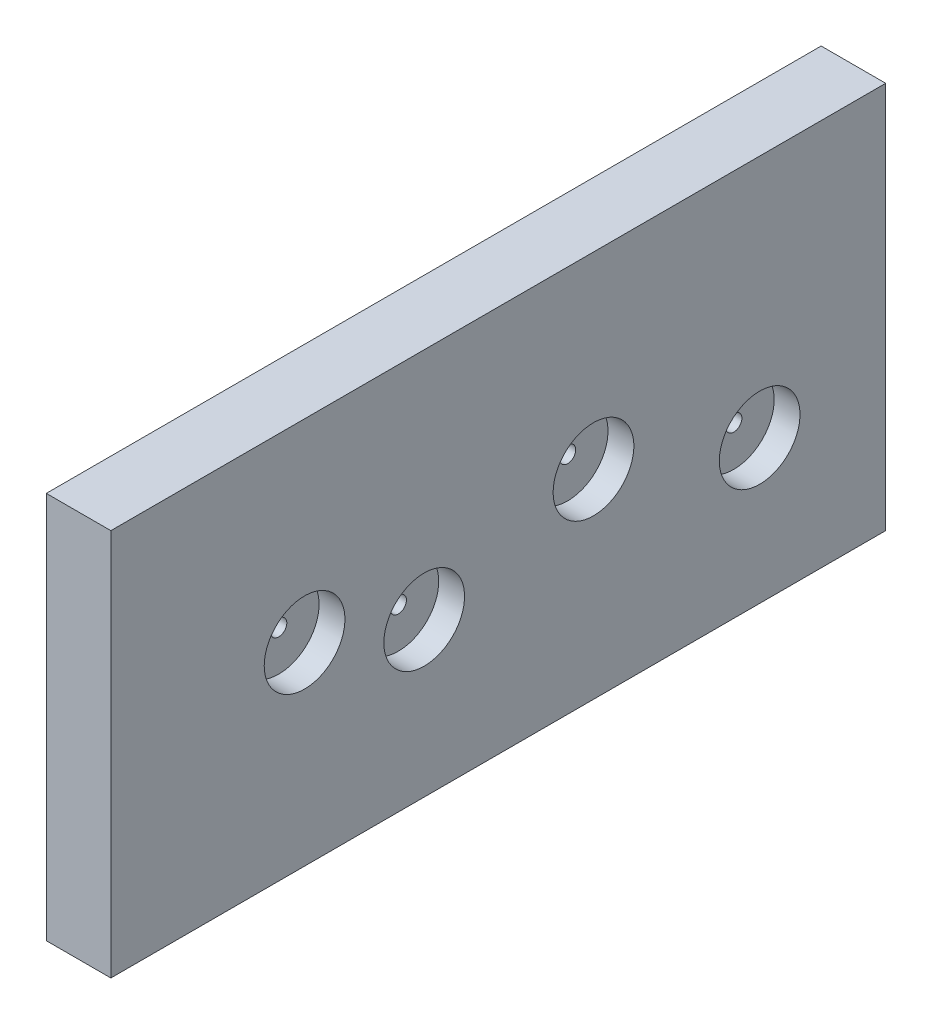
ISO-10303-21;
HEADER;
FILE_DESCRIPTION(('STEP AP214'),'2;1');
FILE_NAME('part.step','',(''),(''),'','','');
FILE_SCHEMA(('AUTOMOTIVE_DESIGN { 1 0 10303 214 1 1 1 1 }'));
ENDSEC;
DATA;
#1=APPLICATION_CONTEXT('core data for automotive mechanical design processes');
#2=APPLICATION_PROTOCOL_DEFINITION('international standard','automotive_design',2000,#1);
#3=PRODUCT_CONTEXT('',#1,'mechanical');
#4=PRODUCT('Part','Part','',(#3));
#5=PRODUCT_RELATED_PRODUCT_CATEGORY('part','',(#4));
#6=PRODUCT_DEFINITION_FORMATION('','',#4);
#7=PRODUCT_DEFINITION_CONTEXT('part definition',#1,'design');
#8=PRODUCT_DEFINITION('design','',#6,#7);
#9=PRODUCT_DEFINITION_SHAPE('','',#8);
#10=(LENGTH_UNIT() NAMED_UNIT(*) SI_UNIT(.MILLI.,.METRE.));
#11=(NAMED_UNIT(*) PLANE_ANGLE_UNIT() SI_UNIT($,.RADIAN.));
#12=(NAMED_UNIT(*) SI_UNIT($,.STERADIAN.) SOLID_ANGLE_UNIT());
#13=UNCERTAINTY_MEASURE_WITH_UNIT(LENGTH_MEASURE(1.E-05),#10,'distance_accuracy_value','');
#14=(GEOMETRIC_REPRESENTATION_CONTEXT(3) GLOBAL_UNCERTAINTY_ASSIGNED_CONTEXT((#13)) GLOBAL_UNIT_ASSIGNED_CONTEXT((#10,
#11,#12)) REPRESENTATION_CONTEXT('',''));
#15=CARTESIAN_POINT('',(0.,0.,0.));
#16=DIRECTION('',(0.,0.,1.));
#17=DIRECTION('',(1.,0.,0.));
#18=AXIS2_PLACEMENT_3D('',#15,#16,#17);
#19=CARTESIAN_POINT('',(12.7,-38.1,0.));
#20=DIRECTION('',(0.,1.,0.));
#21=DIRECTION('',(0.,0.,1.));
#22=AXIS2_PLACEMENT_3D('',#19,#20,#21);
#23=PLANE('',#22);
#24=CARTESIAN_POINT('',(6.35000000000001,-38.1,0.));
#25=DIRECTION('',(0.,-1.,0.));
#26=DIRECTION('',(0.,0.,-1.));
#27=AXIS2_PLACEMENT_3D('',#24,#25,#26);
#28=CIRCLE('',#27,3.175);
#29=CARTESIAN_POINT('',(6.35000000000001,-38.1,-3.175));
#30=VERTEX_POINT('',#29);
#31=EDGE_CURVE('E120',#30,#30,#28,.T.);
#32=ORIENTED_EDGE('',*,*,#31,.F.);
#33=EDGE_LOOP('',(#32));
#34=FACE_BOUND('',#33,.T.);
#35=CARTESIAN_POINT('',(6.35,-38.1,57.15));
#36=DIRECTION('',(0.,-1.,0.));
#37=DIRECTION('',(0.,0.,-1.));
#38=AXIS2_PLACEMENT_3D('',#35,#36,#37);
#39=CIRCLE('',#38,3.175);
#40=CARTESIAN_POINT('',(6.35,-38.1,53.975));
#41=VERTEX_POINT('',#40);
#42=EDGE_CURVE('E119',#41,#41,#39,.T.);
#43=ORIENTED_EDGE('',*,*,#42,.F.);
#44=EDGE_LOOP('',(#43));
#45=FACE_BOUND('',#44,.T.);
#46=CARTESIAN_POINT('',(6.35000000000002,-38.1,-63.5));
#47=DIRECTION('',(0.,-1.,0.));
#48=DIRECTION('',(0.,0.,-1.));
#49=AXIS2_PLACEMENT_3D('',#46,#47,#48);
#50=CIRCLE('',#49,3.175);
#51=CARTESIAN_POINT('',(6.35000000000002,-38.1,-66.675));
#52=VERTEX_POINT('',#51);
#53=EDGE_CURVE('E133',#52,#52,#50,.T.);
#54=ORIENTED_EDGE('',*,*,#53,.F.);
#55=EDGE_LOOP('',(#54));
#56=FACE_BOUND('',#55,.T.);
#57=DIRECTION('',(0.,0.,-1.));
#58=VECTOR('',#57,1.);
#59=CARTESIAN_POINT('',(0.,-38.1,0.));
#60=LINE('',#59,#58);
#61=CARTESIAN_POINT('',(0.,-38.1,76.2));
#62=VERTEX_POINT('',#61);
#63=CARTESIAN_POINT('',(0.,-38.1,-76.2));
#64=VERTEX_POINT('',#63);
#65=EDGE_CURVE('E187',#62,#64,#60,.T.);
#66=ORIENTED_EDGE('',*,*,#65,.T.);
#67=DIRECTION('',(-1.,0.,0.));
#68=VECTOR('',#67,1.);
#69=CARTESIAN_POINT('',(12.7,-38.1,-76.2));
#70=LINE('',#69,#68);
#71=CARTESIAN_POINT('',(12.7,-38.1,-76.2));
#72=VERTEX_POINT('',#71);
#73=EDGE_CURVE('E11',#72,#64,#70,.T.);
#74=ORIENTED_EDGE('',*,*,#73,.F.);
#75=DIRECTION('',(0.,0.,-1.));
#76=VECTOR('',#75,1.);
#77=CARTESIAN_POINT('',(12.7,-38.1,0.));
#78=LINE('',#77,#76);
#79=CARTESIAN_POINT('',(12.7,-38.1,76.2));
#80=VERTEX_POINT('',#79);
#81=EDGE_CURVE('E174',#80,#72,#78,.T.);
#82=ORIENTED_EDGE('',*,*,#81,.F.);
#83=DIRECTION('',(-1.,0.,0.));
#84=VECTOR('',#83,1.);
#85=CARTESIAN_POINT('',(12.7,-38.1,76.2));
#86=LINE('',#85,#84);
#87=EDGE_CURVE('E70',#80,#62,#86,.T.);
#88=ORIENTED_EDGE('',*,*,#87,.T.);
#89=EDGE_LOOP('',(#66,#74,#82,#88));
#90=FACE_BOUND('',#89,.T.);
#91=ADVANCED_FACE('F51',(#34,#45,#56,#90),#23,.F.);
#92=CARTESIAN_POINT('',(12.7,0.,-76.2));
#93=DIRECTION('',(0.,0.,1.));
#94=DIRECTION('',(1.,0.,0.));
#95=AXIS2_PLACEMENT_3D('',#92,#93,#94);
#96=PLANE('',#95);
#97=DIRECTION('',(0.,1.,0.));
#98=VECTOR('',#97,1.);
#99=CARTESIAN_POINT('',(0.,0.,-76.2));
#100=LINE('',#99,#98);
#101=CARTESIAN_POINT('',(0.,38.1,-76.2));
#102=VERTEX_POINT('',#101);
#103=EDGE_CURVE('E190',#64,#102,#100,.T.);
#104=ORIENTED_EDGE('',*,*,#103,.T.);
#105=DIRECTION('',(-1.,0.,0.));
#106=VECTOR('',#105,1.);
#107=CARTESIAN_POINT('',(12.7,38.1,-76.2));
#108=LINE('',#107,#106);
#109=CARTESIAN_POINT('',(12.7,38.1,-76.2));
#110=VERTEX_POINT('',#109);
#111=EDGE_CURVE('E61',#110,#102,#108,.T.);
#112=ORIENTED_EDGE('',*,*,#111,.F.);
#113=DIRECTION('',(0.,1.,0.));
#114=VECTOR('',#113,1.);
#115=CARTESIAN_POINT('',(12.7,0.,-76.2));
#116=LINE('',#115,#114);
#117=EDGE_CURVE('E97',#72,#110,#116,.T.);
#118=ORIENTED_EDGE('',*,*,#117,.F.);
#119=ORIENTED_EDGE('',*,*,#73,.T.);
#120=EDGE_LOOP('',(#104,#112,#118,#119));
#121=FACE_BOUND('',#120,.T.);
#122=ADVANCED_FACE('F275',(#121),#96,.F.);
#123=CARTESIAN_POINT('',(12.7,38.1,0.));
#124=DIRECTION('',(0.,1.,0.));
#125=DIRECTION('',(0.,0.,1.));
#126=AXIS2_PLACEMENT_3D('',#123,#124,#125);
#127=PLANE('',#126);
#128=DIRECTION('',(0.,0.,-1.));
#129=VECTOR('',#128,1.);
#130=CARTESIAN_POINT('',(0.,38.1,0.));
#131=LINE('',#130,#129);
#132=CARTESIAN_POINT('',(0.,38.1,76.2));
#133=VERTEX_POINT('',#132);
#134=EDGE_CURVE('E194',#133,#102,#131,.T.);
#135=ORIENTED_EDGE('',*,*,#134,.F.);
#136=DIRECTION('',(-1.,0.,0.));
#137=VECTOR('',#136,1.);
#138=CARTESIAN_POINT('',(12.7,38.1,76.2));
#139=LINE('',#138,#137);
#140=CARTESIAN_POINT('',(12.7,38.1,76.2));
#141=VERTEX_POINT('',#140);
#142=EDGE_CURVE('E85',#141,#133,#139,.T.);
#143=ORIENTED_EDGE('',*,*,#142,.F.);
#144=DIRECTION('',(0.,0.,-1.));
#145=VECTOR('',#144,1.);
#146=CARTESIAN_POINT('',(12.7,38.1,0.));
#147=LINE('',#146,#145);
#148=EDGE_CURVE('E180',#141,#110,#147,.T.);
#149=ORIENTED_EDGE('',*,*,#148,.T.);
#150=ORIENTED_EDGE('',*,*,#111,.T.);
#151=EDGE_LOOP('',(#135,#143,#149,#150));
#152=FACE_BOUND('',#151,.T.);
#153=ADVANCED_FACE('F245',(#152),#127,.T.);
#154=CARTESIAN_POINT('',(12.7,-9.873506971,-51.4082559918149));
#155=DIRECTION('',(-1.,0.,0.));
#156=DIRECTION('',(0.,0.,1.));
#157=AXIS2_PLACEMENT_3D('',#154,#155,#156);
#158=CYLINDRICAL_SURFACE('',#157,1.5875);
#159=CARTESIAN_POINT('',(7.62,-9.873506971,-51.4082559918149));
#160=DIRECTION('',(-1.,0.,0.));
#161=DIRECTION('',(0.,0.,1.));
#162=AXIS2_PLACEMENT_3D('',#159,#160,#161);
#163=CIRCLE('',#162,1.5875);
#164=CARTESIAN_POINT('',(7.62,-9.873506971,-49.8207559918149));
#165=VERTEX_POINT('',#164);
#166=EDGE_CURVE('E54',#165,#165,#163,.T.);
#167=ORIENTED_EDGE('',*,*,#166,.F.);
#168=EDGE_LOOP('',(#167));
#169=FACE_BOUND('',#168,.T.);
#170=CARTESIAN_POINT('',(0.,-9.873506971,-51.4082559918149));
#171=DIRECTION('',(1.,0.,0.));
#172=DIRECTION('',(0.,0.,-1.));
#173=AXIS2_PLACEMENT_3D('',#170,#171,#172);
#174=CIRCLE('',#173,1.5875);
#175=CARTESIAN_POINT('',(0.,-9.873506971,-52.9957559918149));
#176=VERTEX_POINT('',#175);
#177=EDGE_CURVE('E210',#176,#176,#174,.T.);
#178=ORIENTED_EDGE('',*,*,#177,.F.);
#179=EDGE_LOOP('',(#178));
#180=FACE_BOUND('',#179,.T.);
#181=ADVANCED_FACE('F241',(#169,#180),#158,.F.);
#182=CARTESIAN_POINT('',(12.7,1.096077429,-18.7225315801618));
#183=DIRECTION('',(-1.,0.,0.));
#184=DIRECTION('',(0.,0.,1.));
#185=AXIS2_PLACEMENT_3D('',#182,#183,#184);
#186=CYLINDRICAL_SURFACE('',#185,1.5875);
#187=CARTESIAN_POINT('',(7.62,1.096077429,-18.7225315801618));
#188=DIRECTION('',(-1.,0.,0.));
#189=DIRECTION('',(0.,0.,1.));
#190=AXIS2_PLACEMENT_3D('',#187,#188,#189);
#191=CIRCLE('',#190,1.5875);
#192=CARTESIAN_POINT('',(7.62,1.096077429,-17.1350315801618));
#193=VERTEX_POINT('',#192);
#194=EDGE_CURVE('E229',#193,#193,#191,.T.);
#195=ORIENTED_EDGE('',*,*,#194,.F.);
#196=EDGE_LOOP('',(#195));
#197=FACE_BOUND('',#196,.T.);
#198=CARTESIAN_POINT('',(0.,1.096077429,-18.7225315801618));
#199=DIRECTION('',(1.,0.,0.));
#200=DIRECTION('',(0.,0.,-1.));
#201=AXIS2_PLACEMENT_3D('',#198,#199,#200);
#202=CIRCLE('',#201,1.5875);
#203=CARTESIAN_POINT('',(0.,1.096077429,-20.3100315801618));
#204=VERTEX_POINT('',#203);
#205=EDGE_CURVE('E206',#204,#204,#202,.T.);
#206=ORIENTED_EDGE('',*,*,#205,.F.);
#207=EDGE_LOOP('',(#206));
#208=FACE_BOUND('',#207,.T.);
#209=ADVANCED_FACE('F244',(#197,#208),#186,.F.);
#210=CARTESIAN_POINT('',(12.7,0.,38.1));
#211=DIRECTION('',(-1.,0.,0.));
#212=DIRECTION('',(0.,0.,1.));
#213=AXIS2_PLACEMENT_3D('',#210,#211,#212);
#214=CYLINDRICAL_SURFACE('',#213,1.5875);
#215=CARTESIAN_POINT('',(7.62,0.,38.1));
#216=DIRECTION('',(-1.,0.,0.));
#217=DIRECTION('',(0.,0.,1.));
#218=AXIS2_PLACEMENT_3D('',#215,#216,#217);
#219=CIRCLE('',#218,1.5875);
#220=CARTESIAN_POINT('',(7.62,0.,39.6875));
#221=VERTEX_POINT('',#220);
#222=EDGE_CURVE('E226',#221,#221,#219,.T.);
#223=ORIENTED_EDGE('',*,*,#222,.F.);
#224=EDGE_LOOP('',(#223));
#225=FACE_BOUND('',#224,.T.);
#226=CARTESIAN_POINT('',(0.,0.,38.1));
#227=DIRECTION('',(1.,0.,0.));
#228=DIRECTION('',(0.,0.,-1.));
#229=AXIS2_PLACEMENT_3D('',#226,#227,#228);
#230=CIRCLE('',#229,1.5875);
#231=CARTESIAN_POINT('',(0.,0.,36.5125));
#232=VERTEX_POINT('',#231);
#233=EDGE_CURVE('E202',#232,#232,#230,.T.);
#234=ORIENTED_EDGE('',*,*,#233,.F.);
#235=EDGE_LOOP('',(#234));
#236=FACE_BOUND('',#235,.T.);
#237=ADVANCED_FACE('F271',(#225,#236),#214,.F.);
#238=CARTESIAN_POINT('',(12.7,0.,76.2));
#239=DIRECTION('',(0.,0.,1.));
#240=DIRECTION('',(1.,0.,0.));
#241=AXIS2_PLACEMENT_3D('',#238,#239,#240);
#242=PLANE('',#241);
#243=DIRECTION('',(0.,1.,0.));
#244=VECTOR('',#243,1.);
#245=CARTESIAN_POINT('',(0.,0.,76.2));
#246=LINE('',#245,#244);
#247=EDGE_CURVE('E198',#62,#133,#246,.T.);
#248=ORIENTED_EDGE('',*,*,#247,.F.);
#249=ORIENTED_EDGE('',*,*,#87,.F.);
#250=DIRECTION('',(0.,1.,0.));
#251=VECTOR('',#250,1.);
#252=CARTESIAN_POINT('',(12.7,0.,76.2));
#253=LINE('',#252,#251);
#254=EDGE_CURVE('E184',#80,#141,#253,.T.);
#255=ORIENTED_EDGE('',*,*,#254,.T.);
#256=ORIENTED_EDGE('',*,*,#142,.T.);
#257=EDGE_LOOP('',(#248,#249,#255,#256));
#258=FACE_BOUND('',#257,.T.);
#259=ADVANCED_FACE('F260',(#258),#242,.T.);
#260=CARTESIAN_POINT('',(12.7,-7.860160654,14.5712240149026));
#261=DIRECTION('',(-1.,0.,0.));
#262=DIRECTION('',(0.,0.,1.));
#263=AXIS2_PLACEMENT_3D('',#260,#261,#262);
#264=CYLINDRICAL_SURFACE('',#263,1.5875);
#265=CARTESIAN_POINT('',(7.62,-7.860160654,14.5712240149026));
#266=DIRECTION('',(-1.,0.,0.));
#267=DIRECTION('',(0.,0.,1.));
#268=AXIS2_PLACEMENT_3D('',#265,#266,#267);
#269=CIRCLE('',#268,1.5875);
#270=CARTESIAN_POINT('',(7.62,-7.860160654,16.1587240149026));
#271=VERTEX_POINT('',#270);
#272=EDGE_CURVE('E146',#271,#271,#269,.T.);
#273=ORIENTED_EDGE('',*,*,#272,.F.);
#274=EDGE_LOOP('',(#273));
#275=FACE_BOUND('',#274,.T.);
#276=CARTESIAN_POINT('',(0.,-7.860160654,14.5712240149026));
#277=DIRECTION('',(1.,0.,0.));
#278=DIRECTION('',(0.,0.,-1.));
#279=AXIS2_PLACEMENT_3D('',#276,#277,#278);
#280=CIRCLE('',#279,1.5875);
#281=CARTESIAN_POINT('',(0.,-7.860160654,12.9837240149026));
#282=VERTEX_POINT('',#281);
#283=EDGE_CURVE('E177',#282,#282,#280,.T.);
#284=ORIENTED_EDGE('',*,*,#283,.F.);
#285=EDGE_LOOP('',(#284));
#286=FACE_BOUND('',#285,.T.);
#287=ADVANCED_FACE('F258',(#275,#286),#264,.F.);
#288=CARTESIAN_POINT('',(12.7,0.,0.));
#289=DIRECTION('',(1.,0.,0.));
#290=DIRECTION('',(0.,0.,-1.));
#291=AXIS2_PLACEMENT_3D('',#288,#289,#290);
#292=PLANE('',#291);
#293=CARTESIAN_POINT('',(12.7,0.,38.1));
#294=DIRECTION('',(-1.,0.,0.));
#295=DIRECTION('',(0.,0.,1.));
#296=AXIS2_PLACEMENT_3D('',#293,#294,#295);
#297=CIRCLE('',#296,7.9375);
#298=CARTESIAN_POINT('',(12.7,0.,46.0375));
#299=VERTEX_POINT('',#298);
#300=EDGE_CURVE('E147',#299,#299,#297,.T.);
#301=ORIENTED_EDGE('',*,*,#300,.T.);
#302=EDGE_LOOP('',(#301));
#303=FACE_BOUND('',#302,.T.);
#304=CARTESIAN_POINT('',(12.7,-7.860160654,14.5712240149026));
#305=DIRECTION('',(-1.,0.,0.));
#306=DIRECTION('',(0.,0.,1.));
#307=AXIS2_PLACEMENT_3D('',#304,#305,#306);
#308=CIRCLE('',#307,7.9375);
#309=CARTESIAN_POINT('',(12.7,-7.860160654,22.5087240149026));
#310=VERTEX_POINT('',#309);
#311=EDGE_CURVE('E151',#310,#310,#308,.T.);
#312=ORIENTED_EDGE('',*,*,#311,.T.);
#313=EDGE_LOOP('',(#312));
#314=FACE_BOUND('',#313,.T.);
#315=CARTESIAN_POINT('',(12.7,1.096077429,-18.7225315801618));
#316=DIRECTION('',(-1.,0.,0.));
#317=DIRECTION('',(0.,0.,1.));
#318=AXIS2_PLACEMENT_3D('',#315,#316,#317);
#319=CIRCLE('',#318,7.9375);
#320=CARTESIAN_POINT('',(12.7,1.096077429,-10.7850315801618));
#321=VERTEX_POINT('',#320);
#322=EDGE_CURVE('E159',#321,#321,#319,.T.);
#323=ORIENTED_EDGE('',*,*,#322,.T.);
#324=EDGE_LOOP('',(#323));
#325=FACE_BOUND('',#324,.T.);
#326=CARTESIAN_POINT('',(12.7,-9.873506971,-51.4082559918149));
#327=DIRECTION('',(-1.,0.,0.));
#328=DIRECTION('',(0.,0.,1.));
#329=AXIS2_PLACEMENT_3D('',#326,#327,#328);
#330=CIRCLE('',#329,7.9375);
#331=CARTESIAN_POINT('',(12.7,-9.873506971,-43.4707559918149));
#332=VERTEX_POINT('',#331);
#333=EDGE_CURVE('E167',#332,#332,#330,.T.);
#334=ORIENTED_EDGE('',*,*,#333,.T.);
#335=EDGE_LOOP('',(#334));
#336=FACE_BOUND('',#335,.T.);
#337=ORIENTED_EDGE('',*,*,#81,.T.);
#338=ORIENTED_EDGE('',*,*,#117,.T.);
#339=ORIENTED_EDGE('',*,*,#148,.F.);
#340=ORIENTED_EDGE('',*,*,#254,.F.);
#341=EDGE_LOOP('',(#337,#338,#339,#340));
#342=FACE_BOUND('',#341,.T.);
#343=ADVANCED_FACE('F253',(#303,#314,#325,#336,#342),#292,.T.);
#344=CARTESIAN_POINT('',(0.,0.,0.));
#345=DIRECTION('',(1.,0.,0.));
#346=DIRECTION('',(0.,0.,-1.));
#347=AXIS2_PLACEMENT_3D('',#344,#345,#346);
#348=PLANE('',#347);
#349=ORIENTED_EDGE('',*,*,#65,.F.);
#350=ORIENTED_EDGE('',*,*,#247,.T.);
#351=ORIENTED_EDGE('',*,*,#134,.T.);
#352=ORIENTED_EDGE('',*,*,#103,.F.);
#353=EDGE_LOOP('',(#349,#350,#351,#352));
#354=FACE_BOUND('',#353,.T.);
#355=ORIENTED_EDGE('',*,*,#233,.T.);
#356=EDGE_LOOP('',(#355));
#357=FACE_BOUND('',#356,.T.);
#358=ORIENTED_EDGE('',*,*,#205,.T.);
#359=EDGE_LOOP('',(#358));
#360=FACE_BOUND('',#359,.T.);
#361=ORIENTED_EDGE('',*,*,#177,.T.);
#362=EDGE_LOOP('',(#361));
#363=FACE_BOUND('',#362,.T.);
#364=ORIENTED_EDGE('',*,*,#283,.T.);
#365=EDGE_LOOP('',(#364));
#366=FACE_BOUND('',#365,.T.);
#367=ADVANCED_FACE('F249',(#354,#357,#360,#363,#366),#348,.F.);
#368=CARTESIAN_POINT('',(7.62,-9.873506971,-51.4082559918149));
#369=DIRECTION('',(1.,0.,0.));
#370=DIRECTION('',(0.,0.,-1.));
#371=AXIS2_PLACEMENT_3D('',#368,#369,#370);
#372=CYLINDRICAL_SURFACE('',#371,7.9375);
#373=CARTESIAN_POINT('',(7.62,-9.873506971,-51.4082559918149));
#374=DIRECTION('',(-1.,0.,0.));
#375=DIRECTION('',(0.,0.,1.));
#376=AXIS2_PLACEMENT_3D('',#373,#374,#375);
#377=CIRCLE('',#376,7.9375);
#378=CARTESIAN_POINT('',(7.62,-9.873506971,-43.4707559918149));
#379=VERTEX_POINT('',#378);
#380=EDGE_CURVE('E141',#379,#379,#377,.T.);
#381=ORIENTED_EDGE('',*,*,#380,.T.);
#382=EDGE_LOOP('',(#381));
#383=FACE_BOUND('',#382,.T.);
#384=ORIENTED_EDGE('',*,*,#333,.F.);
#385=EDGE_LOOP('',(#384));
#386=FACE_BOUND('',#385,.T.);
#387=ADVANCED_FACE('F252',(#383,#386),#372,.F.);
#388=CARTESIAN_POINT('',(7.62,-9.873506971,-51.4082559918149));
#389=DIRECTION('',(-1.,0.,0.));
#390=DIRECTION('',(0.,0.,1.));
#391=AXIS2_PLACEMENT_3D('',#388,#389,#390);
#392=PLANE('',#391);
#393=ORIENTED_EDGE('',*,*,#166,.T.);
#394=EDGE_LOOP('',(#393));
#395=FACE_BOUND('',#394,.T.);
#396=ORIENTED_EDGE('',*,*,#380,.F.);
#397=EDGE_LOOP('',(#396));
#398=FACE_BOUND('',#397,.T.);
#399=ADVANCED_FACE('F238',(#395,#398),#392,.F.);
#400=CARTESIAN_POINT('',(7.62,1.096077429,-18.7225315801618));
#401=DIRECTION('',(1.,0.,0.));
#402=DIRECTION('',(0.,0.,-1.));
#403=AXIS2_PLACEMENT_3D('',#400,#401,#402);
#404=CYLINDRICAL_SURFACE('',#403,7.9375);
#405=CARTESIAN_POINT('',(7.62,1.096077429,-18.7225315801618));
#406=DIRECTION('',(-1.,0.,0.));
#407=DIRECTION('',(0.,0.,1.));
#408=AXIS2_PLACEMENT_3D('',#405,#406,#407);
#409=CIRCLE('',#408,7.9375);
#410=CARTESIAN_POINT('',(7.62,1.096077429,-10.7850315801618));
#411=VERTEX_POINT('',#410);
#412=EDGE_CURVE('E163',#411,#411,#409,.T.);
#413=ORIENTED_EDGE('',*,*,#412,.T.);
#414=EDGE_LOOP('',(#413));
#415=FACE_BOUND('',#414,.T.);
#416=ORIENTED_EDGE('',*,*,#322,.F.);
#417=EDGE_LOOP('',(#416));
#418=FACE_BOUND('',#417,.T.);
#419=ADVANCED_FACE('F409',(#415,#418),#404,.F.);
#420=CARTESIAN_POINT('',(7.62,1.096077429,-18.7225315801618));
#421=DIRECTION('',(-1.,0.,0.));
#422=DIRECTION('',(0.,0.,1.));
#423=AXIS2_PLACEMENT_3D('',#420,#421,#422);
#424=PLANE('',#423);
#425=ORIENTED_EDGE('',*,*,#194,.T.);
#426=EDGE_LOOP('',(#425));
#427=FACE_BOUND('',#426,.T.);
#428=ORIENTED_EDGE('',*,*,#412,.F.);
#429=EDGE_LOOP('',(#428));
#430=FACE_BOUND('',#429,.T.);
#431=ADVANCED_FACE('F418',(#427,#430),#424,.F.);
#432=CARTESIAN_POINT('',(7.62,-7.860160654,14.5712240149026));
#433=DIRECTION('',(1.,0.,0.));
#434=DIRECTION('',(0.,0.,-1.));
#435=AXIS2_PLACEMENT_3D('',#432,#433,#434);
#436=CYLINDRICAL_SURFACE('',#435,7.9375);
#437=CARTESIAN_POINT('',(7.62,-7.860160654,14.5712240149026));
#438=DIRECTION('',(-1.,0.,0.));
#439=DIRECTION('',(0.,0.,1.));
#440=AXIS2_PLACEMENT_3D('',#437,#438,#439);
#441=CIRCLE('',#440,7.9375);
#442=CARTESIAN_POINT('',(7.62,-7.860160654,22.5087240149026));
#443=VERTEX_POINT('',#442);
#444=EDGE_CURVE('E155',#443,#443,#441,.T.);
#445=ORIENTED_EDGE('',*,*,#444,.T.);
#446=EDGE_LOOP('',(#445));
#447=FACE_BOUND('',#446,.T.);
#448=ORIENTED_EDGE('',*,*,#311,.F.);
#449=EDGE_LOOP('',(#448));
#450=FACE_BOUND('',#449,.T.);
#451=ADVANCED_FACE('F428',(#447,#450),#436,.F.);
#452=CARTESIAN_POINT('',(7.62,-7.860160654,14.5712240149026));
#453=DIRECTION('',(-1.,0.,0.));
#454=DIRECTION('',(0.,0.,1.));
#455=AXIS2_PLACEMENT_3D('',#452,#453,#454);
#456=PLANE('',#455);
#457=ORIENTED_EDGE('',*,*,#272,.T.);
#458=EDGE_LOOP('',(#457));
#459=FACE_BOUND('',#458,.T.);
#460=ORIENTED_EDGE('',*,*,#444,.F.);
#461=EDGE_LOOP('',(#460));
#462=FACE_BOUND('',#461,.T.);
#463=ADVANCED_FACE('F437',(#459,#462),#456,.F.);
#464=CARTESIAN_POINT('',(7.62,0.,38.1));
#465=DIRECTION('',(1.,0.,0.));
#466=DIRECTION('',(0.,0.,-1.));
#467=AXIS2_PLACEMENT_3D('',#464,#465,#466);
#468=CYLINDRICAL_SURFACE('',#467,7.9375);
#469=CARTESIAN_POINT('',(7.62,0.,38.1));
#470=DIRECTION('',(-1.,0.,0.));
#471=DIRECTION('',(0.,0.,1.));
#472=AXIS2_PLACEMENT_3D('',#469,#470,#471);
#473=CIRCLE('',#472,7.9375);
#474=CARTESIAN_POINT('',(7.62,0.,46.0375));
#475=VERTEX_POINT('',#474);
#476=EDGE_CURVE('E142',#475,#475,#473,.T.);
#477=ORIENTED_EDGE('',*,*,#476,.T.);
#478=EDGE_LOOP('',(#477));
#479=FACE_BOUND('',#478,.T.);
#480=ORIENTED_EDGE('',*,*,#300,.F.);
#481=EDGE_LOOP('',(#480));
#482=FACE_BOUND('',#481,.T.);
#483=ADVANCED_FACE('F447',(#479,#482),#468,.F.);
#484=CARTESIAN_POINT('',(7.62,0.,38.1));
#485=DIRECTION('',(-1.,0.,0.));
#486=DIRECTION('',(0.,0.,1.));
#487=AXIS2_PLACEMENT_3D('',#484,#485,#486);
#488=PLANE('',#487);
#489=ORIENTED_EDGE('',*,*,#222,.T.);
#490=EDGE_LOOP('',(#489));
#491=FACE_BOUND('',#490,.T.);
#492=ORIENTED_EDGE('',*,*,#476,.F.);
#493=EDGE_LOOP('',(#492));
#494=FACE_BOUND('',#493,.T.);
#495=ADVANCED_FACE('F457',(#491,#494),#488,.F.);
#496=CARTESIAN_POINT('',(6.35000000000002,0.,-63.5));
#497=DIRECTION('',(0.,-1.,0.));
#498=DIRECTION('',(0.,0.,-1.));
#499=AXIS2_PLACEMENT_3D('',#496,#497,#498);
#500=CONICAL_SURFACE('',#499,3.17499999999999,1.02974425867665);
#501=CARTESIAN_POINT('',(6.35000000000001,1.9077324654125,-63.5));
#502=VERTEX_POINT('',#501);
#503=VERTEX_LOOP('',#502);
#504=FACE_BOUND('',#503,.T.);
#505=CARTESIAN_POINT('',(6.35000000000002,0.,-63.5));
#506=DIRECTION('',(0.,-1.,0.));
#507=DIRECTION('',(0.,0.,-1.));
#508=AXIS2_PLACEMENT_3D('',#505,#506,#507);
#509=CIRCLE('',#508,3.17499999999999);
#510=CARTESIAN_POINT('',(6.35000000000002,0.,-66.675));
#511=VERTEX_POINT('',#510);
#512=EDGE_CURVE('E137',#511,#511,#509,.T.);
#513=ORIENTED_EDGE('',*,*,#512,.T.);
#514=EDGE_LOOP('',(#513));
#515=FACE_BOUND('',#514,.T.);
#516=ADVANCED_FACE('F467',(#504,#515),#500,.F.);
#517=CARTESIAN_POINT('',(6.35000000000002,-38.1,-63.5));
#518=DIRECTION('',(0.,-1.,0.));
#519=DIRECTION('',(0.,0.,-1.));
#520=AXIS2_PLACEMENT_3D('',#517,#518,#519);
#521=CYLINDRICAL_SURFACE('',#520,3.17499999999999);
#522=ORIENTED_EDGE('',*,*,#512,.F.);
#523=EDGE_LOOP('',(#522));
#524=FACE_BOUND('',#523,.T.);
#525=ORIENTED_EDGE('',*,*,#53,.T.);
#526=EDGE_LOOP('',(#525));
#527=FACE_BOUND('',#526,.T.);
#528=ADVANCED_FACE('F477',(#524,#527),#521,.F.);
#529=CARTESIAN_POINT('',(6.35,0.,57.15));
#530=DIRECTION('',(0.,-1.,0.));
#531=DIRECTION('',(0.,0.,-1.));
#532=AXIS2_PLACEMENT_3D('',#529,#530,#531);
#533=CONICAL_SURFACE('',#532,3.17499999999999,1.02974425867665);
#534=CARTESIAN_POINT('',(6.34999999999999,1.9077324654125,57.15));
#535=VERTEX_POINT('',#534);
#536=VERTEX_LOOP('',#535);
#537=FACE_BOUND('',#536,.T.);
#538=CARTESIAN_POINT('',(6.35,0.,57.15));
#539=DIRECTION('',(0.,-1.,0.));
#540=DIRECTION('',(0.,0.,-1.));
#541=AXIS2_PLACEMENT_3D('',#538,#539,#540);
#542=CIRCLE('',#541,3.17499999999999);
#543=CARTESIAN_POINT('',(6.35,0.,53.975));
#544=VERTEX_POINT('',#543);
#545=EDGE_CURVE('E125',#544,#544,#542,.T.);
#546=ORIENTED_EDGE('',*,*,#545,.T.);
#547=EDGE_LOOP('',(#546));
#548=FACE_BOUND('',#547,.T.);
#549=ADVANCED_FACE('F487',(#537,#548),#533,.F.);
#550=CARTESIAN_POINT('',(6.35,-38.1,57.15));
#551=DIRECTION('',(0.,-1.,0.));
#552=DIRECTION('',(0.,0.,-1.));
#553=AXIS2_PLACEMENT_3D('',#550,#551,#552);
#554=CYLINDRICAL_SURFACE('',#553,3.175);
#555=ORIENTED_EDGE('',*,*,#545,.F.);
#556=EDGE_LOOP('',(#555));
#557=FACE_BOUND('',#556,.T.);
#558=ORIENTED_EDGE('',*,*,#42,.T.);
#559=EDGE_LOOP('',(#558));
#560=FACE_BOUND('',#559,.T.);
#561=ADVANCED_FACE('F112',(#557,#560),#554,.F.);
#562=CARTESIAN_POINT('',(6.35000000000001,0.,0.));
#563=DIRECTION('',(0.,-1.,0.));
#564=DIRECTION('',(0.,0.,-1.));
#565=AXIS2_PLACEMENT_3D('',#562,#563,#564);
#566=CONICAL_SURFACE('',#565,3.17499999999999,1.02974425867665);
#567=CARTESIAN_POINT('',(6.35,1.9077324654125,0.));
#568=VERTEX_POINT('',#567);
#569=VERTEX_LOOP('',#568);
#570=FACE_BOUND('',#569,.T.);
#571=CARTESIAN_POINT('',(6.35000000000001,0.,0.));
#572=DIRECTION('',(0.,-1.,0.));
#573=DIRECTION('',(0.,0.,-1.));
#574=AXIS2_PLACEMENT_3D('',#571,#572,#573);
#575=CIRCLE('',#574,3.17499999999999);
#576=CARTESIAN_POINT('',(6.35000000000001,0.,-3.17499999999999));
#577=VERTEX_POINT('',#576);
#578=EDGE_CURVE('E116',#577,#577,#575,.T.);
#579=ORIENTED_EDGE('',*,*,#578,.T.);
#580=EDGE_LOOP('',(#579));
#581=FACE_BOUND('',#580,.T.);
#582=ADVANCED_FACE('F108',(#570,#581),#566,.F.);
#583=CARTESIAN_POINT('',(6.35000000000001,-38.1,0.));
#584=DIRECTION('',(0.,-1.,0.));
#585=DIRECTION('',(0.,0.,-1.));
#586=AXIS2_PLACEMENT_3D('',#583,#584,#585);
#587=CYLINDRICAL_SURFACE('',#586,3.175);
#588=ORIENTED_EDGE('',*,*,#578,.F.);
#589=EDGE_LOOP('',(#588));
#590=FACE_BOUND('',#589,.T.);
#591=ORIENTED_EDGE('',*,*,#31,.T.);
#592=EDGE_LOOP('',(#591));
#593=FACE_BOUND('',#592,.T.);
#594=ADVANCED_FACE('F111',(#590,#593),#587,.F.);
#595=CLOSED_SHELL('',(#91,#122,#153,#181,#209,#237,#259,#287,#343,#367,#387,#399,#419,#431,#451,
#463,#483,#495,#516,#528,#549,#561,#582,#594));
#596=MANIFOLD_SOLID_BREP('B2',#595);
#597=ADVANCED_BREP_SHAPE_REPRESENTATION('',(#18,#596),#14);
#598=SHAPE_DEFINITION_REPRESENTATION(#9,#597);
ENDSEC;
END-ISO-10303-21;
